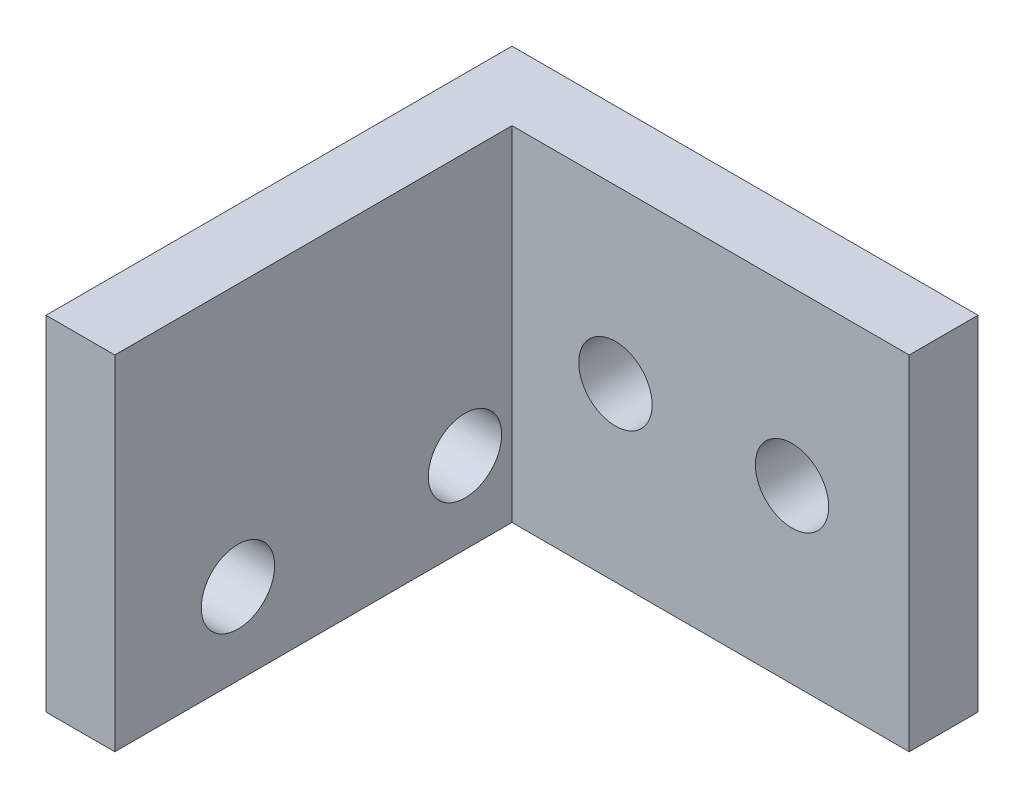
ISO-10303-21;
HEADER;
FILE_DESCRIPTION(('STEP AP214'),'2;1');
FILE_NAME('part.step','',(''),(''),'','','');
FILE_SCHEMA(('AUTOMOTIVE_DESIGN { 1 0 10303 214 1 1 1 1 }'));
ENDSEC;
DATA;
#1=APPLICATION_CONTEXT('core data for automotive mechanical design processes');
#2=APPLICATION_PROTOCOL_DEFINITION('international standard','automotive_design',2000,#1);
#3=PRODUCT_CONTEXT('',#1,'mechanical');
#4=PRODUCT('Part','Part','',(#3));
#5=PRODUCT_RELATED_PRODUCT_CATEGORY('part','',(#4));
#6=PRODUCT_DEFINITION_FORMATION('','',#4);
#7=PRODUCT_DEFINITION_CONTEXT('part definition',#1,'design');
#8=PRODUCT_DEFINITION('design','',#6,#7);
#9=PRODUCT_DEFINITION_SHAPE('','',#8);
#10=(LENGTH_UNIT() NAMED_UNIT(*) SI_UNIT(.MILLI.,.METRE.));
#11=(NAMED_UNIT(*) PLANE_ANGLE_UNIT() SI_UNIT($,.RADIAN.));
#12=(NAMED_UNIT(*) SI_UNIT($,.STERADIAN.) SOLID_ANGLE_UNIT());
#13=UNCERTAINTY_MEASURE_WITH_UNIT(LENGTH_MEASURE(1.E-05),#10,'distance_accuracy_value','');
#14=(GEOMETRIC_REPRESENTATION_CONTEXT(3) GLOBAL_UNCERTAINTY_ASSIGNED_CONTEXT((#13)) GLOBAL_UNIT_ASSIGNED_CONTEXT((#10,
#11,#12)) REPRESENTATION_CONTEXT('',''));
#15=CARTESIAN_POINT('',(0.,0.,0.));
#16=DIRECTION('',(0.,0.,1.));
#17=DIRECTION('',(1.,0.,0.));
#18=AXIS2_PLACEMENT_3D('',#15,#16,#17);
#19=CARTESIAN_POINT('',(3.,14.986,0.));
#20=DIRECTION('',(0.,0.,-1.));
#21=DIRECTION('',(-1.,0.,0.));
#22=AXIS2_PLACEMENT_3D('',#19,#20,#21);
#23=PLANE('',#22);
#24=DIRECTION('',(1.,0.,0.));
#25=VECTOR('',#24,1.);
#26=CARTESIAN_POINT('',(3.,0.,0.));
#27=LINE('',#26,#25);
#28=CARTESIAN_POINT('',(0.,0.,0.));
#29=VERTEX_POINT('',#28);
#30=CARTESIAN_POINT('',(3.,0.,0.));
#31=VERTEX_POINT('',#30);
#32=EDGE_CURVE('E119',#29,#31,#27,.T.);
#33=ORIENTED_EDGE('',*,*,#32,.T.);
#34=DIRECTION('',(0.,-1.,0.));
#35=VECTOR('',#34,1.);
#36=CARTESIAN_POINT('',(3.,14.986,0.));
#37=LINE('',#36,#35);
#38=CARTESIAN_POINT('',(3.,14.986,0.));
#39=VERTEX_POINT('',#38);
#40=EDGE_CURVE('E11',#39,#31,#37,.T.);
#41=ORIENTED_EDGE('',*,*,#40,.F.);
#42=DIRECTION('',(1.,0.,0.));
#43=VECTOR('',#42,1.);
#44=CARTESIAN_POINT('',(3.,14.986,0.));
#45=LINE('',#44,#43);
#46=CARTESIAN_POINT('',(0.,14.986,0.));
#47=VERTEX_POINT('',#46);
#48=EDGE_CURVE('E130',#47,#39,#45,.T.);
#49=ORIENTED_EDGE('',*,*,#48,.F.);
#50=DIRECTION('',(0.,-1.,0.));
#51=VECTOR('',#50,1.);
#52=CARTESIAN_POINT('',(0.,14.986,0.));
#53=LINE('',#52,#51);
#54=EDGE_CURVE('E115',#47,#29,#53,.T.);
#55=ORIENTED_EDGE('',*,*,#54,.T.);
#56=EDGE_LOOP('',(#33,#41,#49,#55));
#57=FACE_BOUND('',#56,.T.);
#58=ADVANCED_FACE('F33',(#57),#23,.F.);
#59=CARTESIAN_POINT('',(3.,14.986,-17.32));
#60=DIRECTION('',(-1.,0.,0.));
#61=DIRECTION('',(0.,0.,1.));
#62=AXIS2_PLACEMENT_3D('',#59,#60,#61);
#63=PLANE('',#62);
#64=CARTESIAN_POINT('',(3.,3.5500000000356,-5.36999999998894));
#65=DIRECTION('',(-1.,0.,0.));
#66=DIRECTION('',(0.,0.,1.));
#67=AXIS2_PLACEMENT_3D('',#64,#65,#66);
#68=CIRCLE('',#67,1.6);
#69=CARTESIAN_POINT('',(3.,3.5500000000356,-3.76999999998894));
#70=VERTEX_POINT('',#69);
#71=EDGE_CURVE('E123',#70,#70,#68,.T.);
#72=ORIENTED_EDGE('',*,*,#71,.T.);
#73=EDGE_LOOP('',(#72));
#74=FACE_BOUND('',#73,.T.);
#75=CARTESIAN_POINT('',(3.,3.55000000003564,-15.2699999999889));
#76=DIRECTION('',(-1.,0.,0.));
#77=DIRECTION('',(0.,0.,1.));
#78=AXIS2_PLACEMENT_3D('',#75,#76,#77);
#79=CIRCLE('',#78,1.6);
#80=CARTESIAN_POINT('',(3.,3.55000000003564,-13.6699999999889));
#81=VERTEX_POINT('',#80);
#82=EDGE_CURVE('E153',#81,#81,#79,.T.);
#83=ORIENTED_EDGE('',*,*,#82,.T.);
#84=EDGE_LOOP('',(#83));
#85=FACE_BOUND('',#84,.T.);
#86=DIRECTION('',(0.,0.,-1.));
#87=VECTOR('',#86,1.);
#88=CARTESIAN_POINT('',(3.,0.,-17.32));
#89=LINE('',#88,#87);
#90=CARTESIAN_POINT('',(3.,0.,-17.32));
#91=VERTEX_POINT('',#90);
#92=EDGE_CURVE('E122',#31,#91,#89,.T.);
#93=ORIENTED_EDGE('',*,*,#92,.T.);
#94=DIRECTION('',(0.,-1.,0.));
#95=VECTOR('',#94,1.);
#96=CARTESIAN_POINT('',(3.,14.986,-17.32));
#97=LINE('',#96,#95);
#98=CARTESIAN_POINT('',(3.,14.986,-17.32));
#99=VERTEX_POINT('',#98);
#100=EDGE_CURVE('E42',#99,#91,#97,.T.);
#101=ORIENTED_EDGE('',*,*,#100,.F.);
#102=DIRECTION('',(0.,0.,-1.));
#103=VECTOR('',#102,1.);
#104=CARTESIAN_POINT('',(3.,14.986,-17.32));
#105=LINE('',#104,#103);
#106=EDGE_CURVE('E88',#39,#99,#105,.T.);
#107=ORIENTED_EDGE('',*,*,#106,.F.);
#108=ORIENTED_EDGE('',*,*,#40,.T.);
#109=EDGE_LOOP('',(#93,#101,#107,#108));
#110=FACE_BOUND('',#109,.T.);
#111=ADVANCED_FACE('F163',(#74,#85,#110),#63,.F.);
#112=CARTESIAN_POINT('',(20.32,14.986,-17.32));
#113=DIRECTION('',(0.,0.,-1.));
#114=DIRECTION('',(-1.,0.,0.));
#115=AXIS2_PLACEMENT_3D('',#112,#113,#114);
#116=PLANE('',#115);
#117=CARTESIAN_POINT('',(7.51020841270324,7.496,-17.32));
#118=DIRECTION('',(0.,0.,1.));
#119=DIRECTION('',(1.,0.,0.));
#120=AXIS2_PLACEMENT_3D('',#117,#118,#119);
#121=CIRCLE('',#120,1.6);
#122=CARTESIAN_POINT('',(9.11020841270324,7.496,-17.32));
#123=VERTEX_POINT('',#122);
#124=EDGE_CURVE('E137',#123,#123,#121,.T.);
#125=ORIENTED_EDGE('',*,*,#124,.F.);
#126=EDGE_LOOP('',(#125));
#127=FACE_BOUND('',#126,.T.);
#128=CARTESIAN_POINT('',(15.2087798556313,7.493,-17.32));
#129=DIRECTION('',(0.,0.,1.));
#130=DIRECTION('',(1.,0.,0.));
#131=AXIS2_PLACEMENT_3D('',#128,#129,#130);
#132=CIRCLE('',#131,1.6);
#133=CARTESIAN_POINT('',(16.8087798556313,7.493,-17.32));
#134=VERTEX_POINT('',#133);
#135=EDGE_CURVE('E143',#134,#134,#132,.T.);
#136=ORIENTED_EDGE('',*,*,#135,.F.);
#137=EDGE_LOOP('',(#136));
#138=FACE_BOUND('',#137,.T.);
#139=DIRECTION('',(1.,0.,0.));
#140=VECTOR('',#139,1.);
#141=CARTESIAN_POINT('',(20.32,0.,-17.32));
#142=LINE('',#141,#140);
#143=CARTESIAN_POINT('',(20.32,0.,-17.32));
#144=VERTEX_POINT('',#143);
#145=EDGE_CURVE('E125',#91,#144,#142,.T.);
#146=ORIENTED_EDGE('',*,*,#145,.T.);
#147=DIRECTION('',(0.,-1.,0.));
#148=VECTOR('',#147,1.);
#149=CARTESIAN_POINT('',(20.32,14.986,-17.32));
#150=LINE('',#149,#148);
#151=CARTESIAN_POINT('',(20.32,14.986,-17.32));
#152=VERTEX_POINT('',#151);
#153=EDGE_CURVE('E110',#152,#144,#150,.T.);
#154=ORIENTED_EDGE('',*,*,#153,.F.);
#155=DIRECTION('',(1.,0.,0.));
#156=VECTOR('',#155,1.);
#157=CARTESIAN_POINT('',(20.32,14.986,-17.32));
#158=LINE('',#157,#156);
#159=EDGE_CURVE('E101',#99,#152,#158,.T.);
#160=ORIENTED_EDGE('',*,*,#159,.F.);
#161=ORIENTED_EDGE('',*,*,#100,.T.);
#162=EDGE_LOOP('',(#146,#154,#160,#161));
#163=FACE_BOUND('',#162,.T.);
#164=ADVANCED_FACE('F166',(#127,#138,#163),#116,.F.);
#165=CARTESIAN_POINT('',(20.32,14.986,-20.32));
#166=DIRECTION('',(-1.,0.,0.));
#167=DIRECTION('',(0.,0.,1.));
#168=AXIS2_PLACEMENT_3D('',#165,#166,#167);
#169=PLANE('',#168);
#170=DIRECTION('',(0.,0.,-1.));
#171=VECTOR('',#170,1.);
#172=CARTESIAN_POINT('',(20.32,0.,-20.32));
#173=LINE('',#172,#171);
#174=CARTESIAN_POINT('',(20.32,0.,-20.32));
#175=VERTEX_POINT('',#174);
#176=EDGE_CURVE('E109',#144,#175,#173,.T.);
#177=ORIENTED_EDGE('',*,*,#176,.T.);
#178=DIRECTION('',(0.,-1.,0.));
#179=VECTOR('',#178,1.);
#180=CARTESIAN_POINT('',(20.32,14.986,-20.32));
#181=LINE('',#180,#179);
#182=CARTESIAN_POINT('',(20.32,14.986,-20.32));
#183=VERTEX_POINT('',#182);
#184=EDGE_CURVE('E106',#183,#175,#181,.T.);
#185=ORIENTED_EDGE('',*,*,#184,.F.);
#186=DIRECTION('',(0.,0.,-1.));
#187=VECTOR('',#186,1.);
#188=CARTESIAN_POINT('',(20.32,14.986,-20.32));
#189=LINE('',#188,#187);
#190=EDGE_CURVE('E95',#152,#183,#189,.T.);
#191=ORIENTED_EDGE('',*,*,#190,.F.);
#192=ORIENTED_EDGE('',*,*,#153,.T.);
#193=EDGE_LOOP('',(#177,#185,#191,#192));
#194=FACE_BOUND('',#193,.T.);
#195=ADVANCED_FACE('F107',(#194),#169,.F.);
#196=CARTESIAN_POINT('',(0.,14.986,-20.32));
#197=DIRECTION('',(0.,0.,1.));
#198=DIRECTION('',(1.,0.,0.));
#199=AXIS2_PLACEMENT_3D('',#196,#197,#198);
#200=PLANE('',#199);
#201=CARTESIAN_POINT('',(7.51020841270324,7.496,-20.32));
#202=DIRECTION('',(0.,0.,1.));
#203=DIRECTION('',(1.,0.,0.));
#204=AXIS2_PLACEMENT_3D('',#201,#202,#203);
#205=CIRCLE('',#204,1.6);
#206=CARTESIAN_POINT('',(9.11020841270324,7.496,-20.32));
#207=VERTEX_POINT('',#206);
#208=EDGE_CURVE('E36',#207,#207,#205,.T.);
#209=ORIENTED_EDGE('',*,*,#208,.T.);
#210=EDGE_LOOP('',(#209));
#211=FACE_BOUND('',#210,.T.);
#212=CARTESIAN_POINT('',(15.2087798556313,7.493,-20.32));
#213=DIRECTION('',(0.,0.,1.));
#214=DIRECTION('',(1.,0.,0.));
#215=AXIS2_PLACEMENT_3D('',#212,#213,#214);
#216=CIRCLE('',#215,1.6);
#217=CARTESIAN_POINT('',(16.8087798556313,7.493,-20.32));
#218=VERTEX_POINT('',#217);
#219=EDGE_CURVE('E135',#218,#218,#216,.T.);
#220=ORIENTED_EDGE('',*,*,#219,.T.);
#221=EDGE_LOOP('',(#220));
#222=FACE_BOUND('',#221,.T.);
#223=DIRECTION('',(-1.,0.,0.));
#224=VECTOR('',#223,1.);
#225=CARTESIAN_POINT('',(0.,0.,-20.32));
#226=LINE('',#225,#224);
#227=CARTESIAN_POINT('',(0.,0.,-20.32));
#228=VERTEX_POINT('',#227);
#229=EDGE_CURVE('E74',#175,#228,#226,.T.);
#230=ORIENTED_EDGE('',*,*,#229,.T.);
#231=DIRECTION('',(0.,-1.,0.));
#232=VECTOR('',#231,1.);
#233=CARTESIAN_POINT('',(0.,14.986,-20.32));
#234=LINE('',#233,#232);
#235=CARTESIAN_POINT('',(0.,14.986,-20.32));
#236=VERTEX_POINT('',#235);
#237=EDGE_CURVE('E111',#236,#228,#234,.T.);
#238=ORIENTED_EDGE('',*,*,#237,.F.);
#239=DIRECTION('',(-1.,0.,0.));
#240=VECTOR('',#239,1.);
#241=CARTESIAN_POINT('',(0.,14.986,-20.32));
#242=LINE('',#241,#240);
#243=EDGE_CURVE('E99',#183,#236,#242,.T.);
#244=ORIENTED_EDGE('',*,*,#243,.F.);
#245=ORIENTED_EDGE('',*,*,#184,.T.);
#246=EDGE_LOOP('',(#230,#238,#244,#245));
#247=FACE_BOUND('',#246,.T.);
#248=ADVANCED_FACE('F113',(#211,#222,#247),#200,.F.);
#249=CARTESIAN_POINT('',(0.,14.986,0.));
#250=DIRECTION('',(1.,0.,0.));
#251=DIRECTION('',(0.,0.,-1.));
#252=AXIS2_PLACEMENT_3D('',#249,#250,#251);
#253=PLANE('',#252);
#254=CARTESIAN_POINT('',(0.,3.5500000000356,-5.36999999998894));
#255=DIRECTION('',(-1.,0.,0.));
#256=DIRECTION('',(0.,0.,1.));
#257=AXIS2_PLACEMENT_3D('',#254,#255,#256);
#258=CIRCLE('',#257,1.6);
#259=CARTESIAN_POINT('',(0.,3.5500000000356,-3.76999999998894));
#260=VERTEX_POINT('',#259);
#261=EDGE_CURVE('E150',#260,#260,#258,.T.);
#262=ORIENTED_EDGE('',*,*,#261,.F.);
#263=EDGE_LOOP('',(#262));
#264=FACE_BOUND('',#263,.T.);
#265=CARTESIAN_POINT('',(0.,3.55000000003564,-15.2699999999889));
#266=DIRECTION('',(-1.,0.,0.));
#267=DIRECTION('',(0.,0.,1.));
#268=AXIS2_PLACEMENT_3D('',#265,#266,#267);
#269=CIRCLE('',#268,1.6);
#270=CARTESIAN_POINT('',(0.,3.55000000003564,-13.6699999999889));
#271=VERTEX_POINT('',#270);
#272=EDGE_CURVE('E141',#271,#271,#269,.T.);
#273=ORIENTED_EDGE('',*,*,#272,.F.);
#274=EDGE_LOOP('',(#273));
#275=FACE_BOUND('',#274,.T.);
#276=DIRECTION('',(0.,0.,1.));
#277=VECTOR('',#276,1.);
#278=CARTESIAN_POINT('',(0.,0.,0.));
#279=LINE('',#278,#277);
#280=EDGE_CURVE('E80',#228,#29,#279,.T.);
#281=ORIENTED_EDGE('',*,*,#280,.T.);
#282=ORIENTED_EDGE('',*,*,#54,.F.);
#283=DIRECTION('',(0.,0.,1.));
#284=VECTOR('',#283,1.);
#285=CARTESIAN_POINT('',(0.,14.986,0.));
#286=LINE('',#285,#284);
#287=EDGE_CURVE('E51',#236,#47,#286,.T.);
#288=ORIENTED_EDGE('',*,*,#287,.F.);
#289=ORIENTED_EDGE('',*,*,#237,.T.);
#290=EDGE_LOOP('',(#281,#282,#288,#289));
#291=FACE_BOUND('',#290,.T.);
#292=ADVANCED_FACE('F171',(#264,#275,#291),#253,.F.);
#293=CARTESIAN_POINT('',(0.,14.986,0.));
#294=DIRECTION('',(0.,-1.,0.));
#295=DIRECTION('',(0.,0.,-1.));
#296=AXIS2_PLACEMENT_3D('',#293,#294,#295);
#297=PLANE('',#296);
#298=ORIENTED_EDGE('',*,*,#48,.T.);
#299=ORIENTED_EDGE('',*,*,#106,.T.);
#300=ORIENTED_EDGE('',*,*,#159,.T.);
#301=ORIENTED_EDGE('',*,*,#190,.T.);
#302=ORIENTED_EDGE('',*,*,#243,.T.);
#303=ORIENTED_EDGE('',*,*,#287,.T.);
#304=EDGE_LOOP('',(#298,#299,#300,#301,#302,#303));
#305=FACE_BOUND('',#304,.T.);
#306=ADVANCED_FACE('F97',(#305),#297,.F.);
#307=CARTESIAN_POINT('',(0.,0.,0.));
#308=DIRECTION('',(0.,-1.,0.));
#309=DIRECTION('',(0.,0.,-1.));
#310=AXIS2_PLACEMENT_3D('',#307,#308,#309);
#311=PLANE('',#310);
#312=ORIENTED_EDGE('',*,*,#32,.F.);
#313=ORIENTED_EDGE('',*,*,#280,.F.);
#314=ORIENTED_EDGE('',*,*,#229,.F.);
#315=ORIENTED_EDGE('',*,*,#176,.F.);
#316=ORIENTED_EDGE('',*,*,#145,.F.);
#317=ORIENTED_EDGE('',*,*,#92,.F.);
#318=EDGE_LOOP('',(#312,#313,#314,#315,#316,#317));
#319=FACE_BOUND('',#318,.T.);
#320=ADVANCED_FACE('F169',(#319),#311,.T.);
#321=CARTESIAN_POINT('',(25.,3.55000000003564,-15.2699999999889));
#322=DIRECTION('',(-1.,0.,0.));
#323=DIRECTION('',(0.,0.,1.));
#324=AXIS2_PLACEMENT_3D('',#321,#322,#323);
#325=CYLINDRICAL_SURFACE('',#324,1.6);
#326=ORIENTED_EDGE('',*,*,#272,.T.);
#327=EDGE_LOOP('',(#326));
#328=FACE_BOUND('',#327,.T.);
#329=ORIENTED_EDGE('',*,*,#82,.F.);
#330=EDGE_LOOP('',(#329));
#331=FACE_BOUND('',#330,.T.);
#332=ADVANCED_FACE('F225',(#328,#331),#325,.F.);
#333=CARTESIAN_POINT('',(25.,3.5500000000356,-5.36999999998894));
#334=DIRECTION('',(-1.,0.,0.));
#335=DIRECTION('',(0.,0.,1.));
#336=AXIS2_PLACEMENT_3D('',#333,#334,#335);
#337=CYLINDRICAL_SURFACE('',#336,1.6);
#338=ORIENTED_EDGE('',*,*,#261,.T.);
#339=EDGE_LOOP('',(#338));
#340=FACE_BOUND('',#339,.T.);
#341=ORIENTED_EDGE('',*,*,#71,.F.);
#342=EDGE_LOOP('',(#341));
#343=FACE_BOUND('',#342,.T.);
#344=ADVANCED_FACE('F230',(#340,#343),#337,.F.);
#345=CARTESIAN_POINT('',(15.2087798556313,7.493,-42.32));
#346=DIRECTION('',(0.,0.,1.));
#347=DIRECTION('',(1.,0.,0.));
#348=AXIS2_PLACEMENT_3D('',#345,#346,#347);
#349=CYLINDRICAL_SURFACE('',#348,1.6);
#350=ORIENTED_EDGE('',*,*,#135,.T.);
#351=EDGE_LOOP('',(#350));
#352=FACE_BOUND('',#351,.T.);
#353=ORIENTED_EDGE('',*,*,#219,.F.);
#354=EDGE_LOOP('',(#353));
#355=FACE_BOUND('',#354,.T.);
#356=ADVANCED_FACE('F238',(#352,#355),#349,.F.);
#357=CARTESIAN_POINT('',(7.51020841270324,7.496,-42.32));
#358=DIRECTION('',(0.,0.,1.));
#359=DIRECTION('',(1.,0.,0.));
#360=AXIS2_PLACEMENT_3D('',#357,#358,#359);
#361=CYLINDRICAL_SURFACE('',#360,1.6);
#362=ORIENTED_EDGE('',*,*,#124,.T.);
#363=EDGE_LOOP('',(#362));
#364=FACE_BOUND('',#363,.T.);
#365=ORIENTED_EDGE('',*,*,#208,.F.);
#366=EDGE_LOOP('',(#365));
#367=FACE_BOUND('',#366,.T.);
#368=ADVANCED_FACE('F245',(#364,#367),#361,.F.);
#369=CLOSED_SHELL('',(#58,#111,#164,#195,#248,#292,#306,#320,#332,#344,#356,#368));
#370=MANIFOLD_SOLID_BREP('B2',#369);
#371=ADVANCED_BREP_SHAPE_REPRESENTATION('',(#18,#370),#14);
#372=SHAPE_DEFINITION_REPRESENTATION(#9,#371);
ENDSEC;
END-ISO-10303-21;
